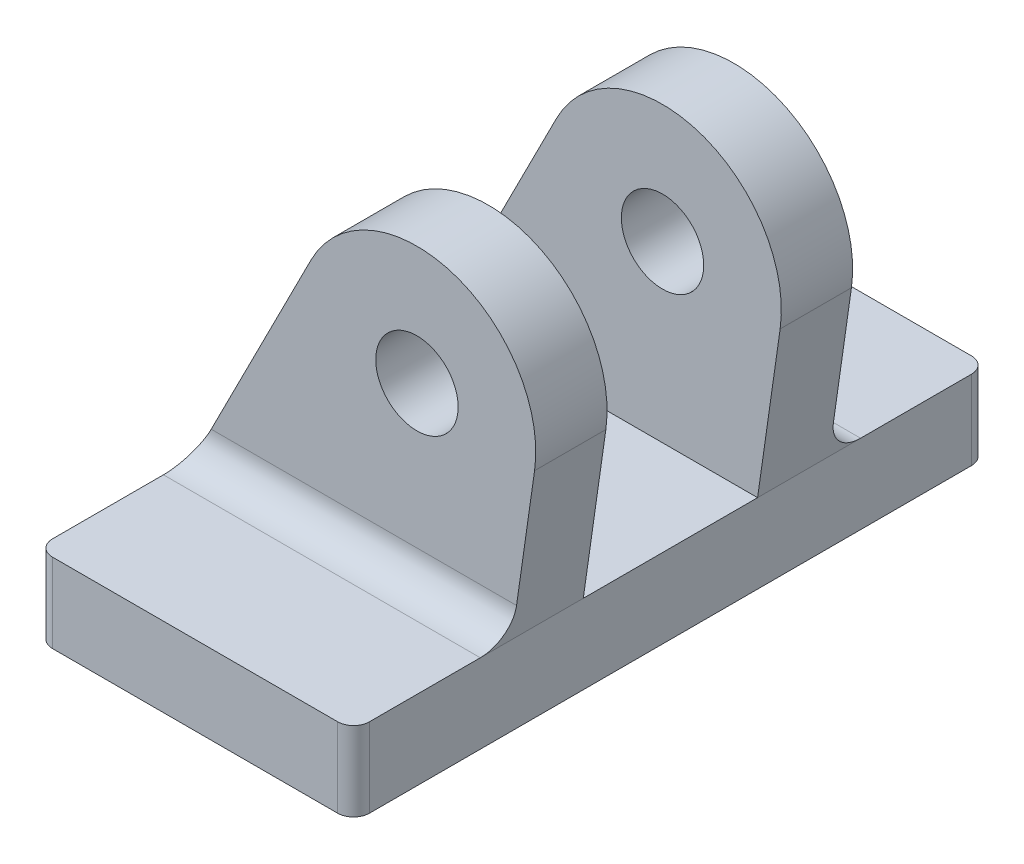
ISO-10303-21;
HEADER;
FILE_DESCRIPTION(('STEP AP214'),'2;1');
FILE_NAME('part.step','',(''),(''),'','','');
FILE_SCHEMA(('AUTOMOTIVE_DESIGN { 1 0 10303 214 1 1 1 1 }'));
ENDSEC;
DATA;
#1=APPLICATION_CONTEXT('core data for automotive mechanical design processes');
#2=APPLICATION_PROTOCOL_DEFINITION('international standard','automotive_design',2000,#1);
#3=PRODUCT_CONTEXT('',#1,'mechanical');
#4=PRODUCT('Part','Part','',(#3));
#5=PRODUCT_RELATED_PRODUCT_CATEGORY('part','',(#4));
#6=PRODUCT_DEFINITION_FORMATION('','',#4);
#7=PRODUCT_DEFINITION_CONTEXT('part definition',#1,'design');
#8=PRODUCT_DEFINITION('design','',#6,#7);
#9=PRODUCT_DEFINITION_SHAPE('','',#8);
#10=(LENGTH_UNIT() NAMED_UNIT(*) SI_UNIT(.MILLI.,.METRE.));
#11=(NAMED_UNIT(*) PLANE_ANGLE_UNIT() SI_UNIT($,.RADIAN.));
#12=(NAMED_UNIT(*) SI_UNIT($,.STERADIAN.) SOLID_ANGLE_UNIT());
#13=UNCERTAINTY_MEASURE_WITH_UNIT(LENGTH_MEASURE(1.E-05),#10,'distance_accuracy_value','');
#14=(GEOMETRIC_REPRESENTATION_CONTEXT(3) GLOBAL_UNCERTAINTY_ASSIGNED_CONTEXT((#13)) GLOBAL_UNIT_ASSIGNED_CONTEXT((#10,
#11,#12)) REPRESENTATION_CONTEXT('',''));
#15=CARTESIAN_POINT('',(0.,0.,0.));
#16=DIRECTION('',(0.,0.,1.));
#17=DIRECTION('',(1.,0.,0.));
#18=AXIS2_PLACEMENT_3D('',#15,#16,#17);
#19=CARTESIAN_POINT('',(9.09646430033625,-1.30381127766227,10.));
#20=DIRECTION('',(0.989883627066026,-0.141881657963986,0.));
#21=DIRECTION('',(0.141881657963986,0.989883627066026,0.));
#22=AXIS2_PLACEMENT_3D('',#19,#20,#21);
#23=PLANE('',#22);
#24=DIRECTION('',(0.,0.,-1.));
#25=VECTOR('',#24,1.);
#26=CARTESIAN_POINT('',(11.4241272029952,14.9358875652701,10.));
#27=LINE('',#26,#25);
#28=CARTESIAN_POINT('',(11.4241272029952,14.9358875652701,-5.5));
#29=VERTEX_POINT('',#28);
#30=CARTESIAN_POINT('',(11.4241272029952,14.9358875652701,-10.));
#31=VERTEX_POINT('',#30);
#32=EDGE_CURVE('E172',#29,#31,#27,.T.);
#33=ORIENTED_EDGE('',*,*,#32,.F.);
#34=DIRECTION('',(-0.141881657963986,-0.989883627066026,0.));
#35=VECTOR('',#34,1.);
#36=CARTESIAN_POINT('',(9.09646430033625,-1.30381127766227,-5.5));
#37=LINE('',#36,#35);
#38=CARTESIAN_POINT('',(10.,5.,-5.5));
#39=VERTEX_POINT('',#38);
#40=EDGE_CURVE('E156',#29,#39,#37,.T.);
#41=ORIENTED_EDGE('',*,*,#40,.T.);
#42=DIRECTION('',(0.,0.,-1.));
#43=VECTOR('',#42,1.);
#44=CARTESIAN_POINT('',(10.,5.,10.));
#45=LINE('',#44,#43);
#46=CARTESIAN_POINT('',(10.,5.,-12.));
#47=VERTEX_POINT('',#46);
#48=EDGE_CURVE('E292',#39,#47,#45,.T.);
#49=ORIENTED_EDGE('',*,*,#48,.T.);
#50=CARTESIAN_POINT('',(10.286663308867,7.,-12.));
#51=DIRECTION('',(0.989883627066026,-0.141881657963986,0.));
#52=DIRECTION('',(0.141881657963986,0.989883627066026,0.));
#53=AXIS2_PLACEMENT_3D('',#50,#51,#52);
#54=ELLIPSE('',#53,2.02043951967154,2.);
#55=CARTESIAN_POINT('',(10.286663308867,7.00000000000001,-10.));
#56=VERTEX_POINT('',#55);
#57=EDGE_CURVE('E243',#47,#56,#54,.F.);
#58=ORIENTED_EDGE('',*,*,#57,.T.);
#59=DIRECTION('',(-0.141881657963986,-0.989883627066026,0.));
#60=VECTOR('',#59,1.);
#61=CARTESIAN_POINT('',(9.09646430033625,-1.30381127766227,-10.));
#62=LINE('',#61,#60);
#63=EDGE_CURVE('E179',#31,#56,#62,.T.);
#64=ORIENTED_EDGE('',*,*,#63,.F.);
#65=EDGE_LOOP('',(#33,#41,#49,#58,#64));
#66=FACE_BOUND('',#65,.T.);
#67=ADVANCED_FACE('F35',(#66),#23,.T.);
#68=CARTESIAN_POINT('',(4.,16.,10.));
#69=DIRECTION('',(0.,0.,-1.));
#70=DIRECTION('',(-1.,0.,0.));
#71=AXIS2_PLACEMENT_3D('',#68,#69,#70);
#72=CYLINDRICAL_SURFACE('',#71,7.5);
#73=CARTESIAN_POINT('',(4.,16.,-5.5));
#74=DIRECTION('',(0.,0.,1.));
#75=DIRECTION('',(1.,0.,0.));
#76=AXIS2_PLACEMENT_3D('',#73,#74,#75);
#77=CIRCLE('',#76,7.5);
#78=CARTESIAN_POINT('',(-2.68671864072965,19.3967328154741,-5.5));
#79=VERTEX_POINT('',#78);
#80=EDGE_CURVE('E159',#29,#79,#77,.T.);
#81=ORIENTED_EDGE('',*,*,#80,.F.);
#82=ORIENTED_EDGE('',*,*,#32,.T.);
#83=CARTESIAN_POINT('',(4.,16.,-10.));
#84=DIRECTION('',(0.,0.,1.));
#85=DIRECTION('',(1.,0.,0.));
#86=AXIS2_PLACEMENT_3D('',#83,#84,#85);
#87=CIRCLE('',#86,7.5);
#88=CARTESIAN_POINT('',(-2.68671864072965,19.3967328154741,-10.));
#89=VERTEX_POINT('',#88);
#90=EDGE_CURVE('E295',#31,#89,#87,.T.);
#91=ORIENTED_EDGE('',*,*,#90,.T.);
#92=DIRECTION('',(0.,0.,-1.));
#93=VECTOR('',#92,1.);
#94=CARTESIAN_POINT('',(-2.68671864072965,19.3967328154741,10.));
#95=LINE('',#94,#93);
#96=EDGE_CURVE('E174',#79,#89,#95,.T.);
#97=ORIENTED_EDGE('',*,*,#96,.F.);
#98=EDGE_LOOP('',(#81,#82,#91,#97));
#99=FACE_BOUND('',#98,.T.);
#100=ADVANCED_FACE('F170',(#99),#72,.T.);
#101=CARTESIAN_POINT('',(-9.96776968847748,5.06344774127433,10.));
#102=DIRECTION('',(0.89156248543062,-0.45289770872988,0.));
#103=DIRECTION('',(0.45289770872988,0.89156248543062,0.));
#104=AXIS2_PLACEMENT_3D('',#101,#102,#103);
#105=PLANE('',#104);
#106=DIRECTION('',(-0.45289770872988,-0.89156248543062,0.));
#107=VECTOR('',#106,1.);
#108=CARTESIAN_POINT('',(-9.96776968847748,5.06344774127433,-5.5));
#109=LINE('',#108,#107);
#110=CARTESIAN_POINT('',(-10.,5.,-5.5));
#111=VERTEX_POINT('',#110);
#112=EDGE_CURVE('E175',#79,#111,#109,.T.);
#113=ORIENTED_EDGE('',*,*,#112,.F.);
#114=ORIENTED_EDGE('',*,*,#96,.T.);
#115=DIRECTION('',(-0.45289770872988,-0.89156248543062,0.));
#116=VECTOR('',#115,1.);
#117=CARTESIAN_POINT('',(-9.96776968847748,5.06344774127433,-10.));
#118=LINE('',#117,#116);
#119=CARTESIAN_POINT('',(-8.9840359680205,7.,-10.));
#120=VERTEX_POINT('',#119);
#121=EDGE_CURVE('E285',#89,#120,#118,.T.);
#122=ORIENTED_EDGE('',*,*,#121,.T.);
#123=CARTESIAN_POINT('',(-8.9840359680205,7.,-12.));
#124=DIRECTION('',(0.89156248543062,-0.45289770872988,0.));
#125=DIRECTION('',(0.45289770872988,0.89156248543062,0.));
#126=AXIS2_PLACEMENT_3D('',#123,#124,#125);
#127=ELLIPSE('',#126,2.24325275309673,2.);
#128=CARTESIAN_POINT('',(-10.,5.,-12.));
#129=VERTEX_POINT('',#128);
#130=EDGE_CURVE('E245',#120,#129,#127,.T.);
#131=ORIENTED_EDGE('',*,*,#130,.T.);
#132=DIRECTION('',(0.,0.,-1.));
#133=VECTOR('',#132,1.);
#134=CARTESIAN_POINT('',(-10.,5.,10.));
#135=LINE('',#134,#133);
#136=EDGE_CURVE('E299',#111,#129,#135,.T.);
#137=ORIENTED_EDGE('',*,*,#136,.F.);
#138=EDGE_LOOP('',(#113,#114,#122,#131,#137));
#139=FACE_BOUND('',#138,.T.);
#140=ADVANCED_FACE('F312',(#139),#105,.F.);
#141=CARTESIAN_POINT('',(4.,16.,10.));
#142=DIRECTION('',(0.,0.,-1.));
#143=DIRECTION('',(-1.,0.,0.));
#144=AXIS2_PLACEMENT_3D('',#141,#142,#143);
#145=CYLINDRICAL_SURFACE('',#144,2.6);
#146=CARTESIAN_POINT('',(4.,16.,-10.));
#147=DIRECTION('',(0.,0.,1.));
#148=DIRECTION('',(1.,0.,0.));
#149=AXIS2_PLACEMENT_3D('',#146,#147,#148);
#150=CIRCLE('',#149,2.6);
#151=CARTESIAN_POINT('',(6.6,16.,-10.));
#152=VERTEX_POINT('',#151);
#153=EDGE_CURVE('E273',#152,#152,#150,.T.);
#154=ORIENTED_EDGE('',*,*,#153,.F.);
#155=EDGE_LOOP('',(#154));
#156=FACE_BOUND('',#155,.T.);
#157=CARTESIAN_POINT('',(4.,16.,-5.5));
#158=DIRECTION('',(0.,0.,1.));
#159=DIRECTION('',(1.,0.,0.));
#160=AXIS2_PLACEMENT_3D('',#157,#158,#159);
#161=CIRCLE('',#160,2.6);
#162=CARTESIAN_POINT('',(6.6,16.,-5.5));
#163=VERTEX_POINT('',#162);
#164=EDGE_CURVE('E166',#163,#163,#161,.T.);
#165=ORIENTED_EDGE('',*,*,#164,.T.);
#166=EDGE_LOOP('',(#165));
#167=FACE_BOUND('',#166,.T.);
#168=ADVANCED_FACE('F342',(#156,#167),#145,.F.);
#169=DIRECTION('',(-0.141881657963986,-0.989883627066026,0.));
#170=VECTOR('',#169,1.);
#171=CARTESIAN_POINT('',(9.09646430033625,-1.30381127766227,5.5));
#172=LINE('',#171,#170);
#173=CARTESIAN_POINT('',(11.4241272029952,14.9358875652701,5.5));
#174=VERTEX_POINT('',#173);
#175=CARTESIAN_POINT('',(10.,5.,5.5));
#176=VERTEX_POINT('',#175);
#177=EDGE_CURVE('E379',#174,#176,#172,.T.);
#178=ORIENTED_EDGE('',*,*,#177,.F.);
#179=CARTESIAN_POINT('',(11.4241272029952,14.9358875652701,10.));
#180=VERTEX_POINT('',#179);
#181=EDGE_CURVE('E180',#180,#174,#27,.T.);
#182=ORIENTED_EDGE('',*,*,#181,.F.);
#183=DIRECTION('',(-0.141881657963986,-0.989883627066026,0.));
#184=VECTOR('',#183,1.);
#185=CARTESIAN_POINT('',(9.09646430033625,-1.30381127766227,10.));
#186=LINE('',#185,#184);
#187=CARTESIAN_POINT('',(10.286663308867,7.00000000000001,10.));
#188=VERTEX_POINT('',#187);
#189=EDGE_CURVE('E254',#180,#188,#186,.T.);
#190=ORIENTED_EDGE('',*,*,#189,.T.);
#191=CARTESIAN_POINT('',(10.286663308867,7.,12.));
#192=DIRECTION('',(0.989883627066026,-0.141881657963986,0.));
#193=DIRECTION('',(-0.141881657963986,-0.989883627066026,0.));
#194=AXIS2_PLACEMENT_3D('',#191,#192,#193);
#195=ELLIPSE('',#194,2.02043951967154,2.);
#196=CARTESIAN_POINT('',(10.,5.,12.));
#197=VERTEX_POINT('',#196);
#198=EDGE_CURVE('E44',#188,#197,#195,.F.);
#199=ORIENTED_EDGE('',*,*,#198,.T.);
#200=EDGE_CURVE('E51',#197,#176,#45,.T.);
#201=ORIENTED_EDGE('',*,*,#200,.T.);
#202=EDGE_LOOP('',(#178,#182,#190,#199,#201));
#203=FACE_BOUND('',#202,.T.);
#204=ADVANCED_FACE('F252',(#203),#23,.T.);
#205=ORIENTED_EDGE('',*,*,#181,.T.);
#206=CARTESIAN_POINT('',(4.,16.,5.5));
#207=DIRECTION('',(0.,0.,1.));
#208=DIRECTION('',(1.,0.,0.));
#209=AXIS2_PLACEMENT_3D('',#206,#207,#208);
#210=CIRCLE('',#209,7.5);
#211=CARTESIAN_POINT('',(-2.68671864072965,19.3967328154741,5.5));
#212=VERTEX_POINT('',#211);
#213=EDGE_CURVE('E376',#174,#212,#210,.T.);
#214=ORIENTED_EDGE('',*,*,#213,.T.);
#215=CARTESIAN_POINT('',(-2.68671864072965,19.3967328154741,10.));
#216=VERTEX_POINT('',#215);
#217=EDGE_CURVE('E181',#216,#212,#95,.T.);
#218=ORIENTED_EDGE('',*,*,#217,.F.);
#219=CARTESIAN_POINT('',(4.,16.,10.));
#220=DIRECTION('',(0.,0.,1.));
#221=DIRECTION('',(1.,0.,0.));
#222=AXIS2_PLACEMENT_3D('',#219,#220,#221);
#223=CIRCLE('',#222,7.5);
#224=EDGE_CURVE('E287',#180,#216,#223,.T.);
#225=ORIENTED_EDGE('',*,*,#224,.F.);
#226=EDGE_LOOP('',(#205,#214,#218,#225));
#227=FACE_BOUND('',#226,.T.);
#228=ADVANCED_FACE('F339',(#227),#72,.T.);
#229=ORIENTED_EDGE('',*,*,#217,.T.);
#230=DIRECTION('',(-0.45289770872988,-0.89156248543062,0.));
#231=VECTOR('',#230,1.);
#232=CARTESIAN_POINT('',(-9.96776968847748,5.06344774127433,5.5));
#233=LINE('',#232,#231);
#234=CARTESIAN_POINT('',(-10.,5.,5.5));
#235=VERTEX_POINT('',#234);
#236=EDGE_CURVE('E371',#212,#235,#233,.T.);
#237=ORIENTED_EDGE('',*,*,#236,.T.);
#238=CARTESIAN_POINT('',(-10.,5.,12.));
#239=VERTEX_POINT('',#238);
#240=EDGE_CURVE('E270',#239,#235,#135,.T.);
#241=ORIENTED_EDGE('',*,*,#240,.F.);
#242=CARTESIAN_POINT('',(-8.9840359680205,7.,12.));
#243=DIRECTION('',(0.89156248543062,-0.45289770872988,0.));
#244=DIRECTION('',(-0.45289770872988,-0.89156248543062,0.));
#245=AXIS2_PLACEMENT_3D('',#242,#243,#244);
#246=ELLIPSE('',#245,2.24325275309673,2.);
#247=CARTESIAN_POINT('',(-8.9840359680205,7.,10.));
#248=VERTEX_POINT('',#247);
#249=EDGE_CURVE('E11',#239,#248,#246,.T.);
#250=ORIENTED_EDGE('',*,*,#249,.T.);
#251=DIRECTION('',(-0.45289770872988,-0.89156248543062,0.));
#252=VECTOR('',#251,1.);
#253=CARTESIAN_POINT('',(-9.96776968847748,5.06344774127433,10.));
#254=LINE('',#253,#252);
#255=EDGE_CURVE('E290',#216,#248,#254,.T.);
#256=ORIENTED_EDGE('',*,*,#255,.F.);
#257=EDGE_LOOP('',(#229,#237,#241,#250,#256));
#258=FACE_BOUND('',#257,.T.);
#259=ADVANCED_FACE('F347',(#258),#105,.F.);
#260=CARTESIAN_POINT('',(4.,16.,5.5));
#261=DIRECTION('',(0.,0.,1.));
#262=DIRECTION('',(1.,0.,0.));
#263=AXIS2_PLACEMENT_3D('',#260,#261,#262);
#264=CIRCLE('',#263,2.6);
#265=CARTESIAN_POINT('',(6.6,16.,5.5));
#266=VERTEX_POINT('',#265);
#267=EDGE_CURVE('E365',#266,#266,#264,.T.);
#268=ORIENTED_EDGE('',*,*,#267,.F.);
#269=EDGE_LOOP('',(#268));
#270=FACE_BOUND('',#269,.T.);
#271=CARTESIAN_POINT('',(4.,16.,10.));
#272=DIRECTION('',(0.,0.,1.));
#273=DIRECTION('',(1.,0.,0.));
#274=AXIS2_PLACEMENT_3D('',#271,#272,#273);
#275=CIRCLE('',#274,2.6);
#276=CARTESIAN_POINT('',(6.6,16.,10.));
#277=VERTEX_POINT('',#276);
#278=EDGE_CURVE('E282',#277,#277,#275,.T.);
#279=ORIENTED_EDGE('',*,*,#278,.T.);
#280=EDGE_LOOP('',(#279));
#281=FACE_BOUND('',#280,.T.);
#282=ADVANCED_FACE('F329',(#270,#281),#145,.F.);
#283=CARTESIAN_POINT('',(0.,0.,10.));
#284=DIRECTION('',(0.,0.,1.));
#285=DIRECTION('',(1.,0.,0.));
#286=AXIS2_PLACEMENT_3D('',#283,#284,#285);
#287=PLANE('',#286);
#288=ORIENTED_EDGE('',*,*,#278,.F.);
#289=EDGE_LOOP('',(#288));
#290=FACE_BOUND('',#289,.T.);
#291=ORIENTED_EDGE('',*,*,#255,.T.);
#292=DIRECTION('',(1.,0.,0.));
#293=VECTOR('',#292,1.);
#294=CARTESIAN_POINT('',(10.,7.,10.));
#295=LINE('',#294,#293);
#296=EDGE_CURVE('E237',#248,#188,#295,.T.);
#297=ORIENTED_EDGE('',*,*,#296,.T.);
#298=ORIENTED_EDGE('',*,*,#189,.F.);
#299=ORIENTED_EDGE('',*,*,#224,.T.);
#300=EDGE_LOOP('',(#291,#297,#298,#299));
#301=FACE_BOUND('',#300,.T.);
#302=ADVANCED_FACE('F321',(#290,#301),#287,.T.);
#303=CARTESIAN_POINT('',(0.,0.,-10.));
#304=DIRECTION('',(0.,0.,1.));
#305=DIRECTION('',(1.,0.,0.));
#306=AXIS2_PLACEMENT_3D('',#303,#304,#305);
#307=PLANE('',#306);
#308=ORIENTED_EDGE('',*,*,#153,.T.);
#309=EDGE_LOOP('',(#308));
#310=FACE_BOUND('',#309,.T.);
#311=ORIENTED_EDGE('',*,*,#63,.T.);
#312=DIRECTION('',(1.,0.,0.));
#313=VECTOR('',#312,1.);
#314=CARTESIAN_POINT('',(0.,7.,-10.));
#315=LINE('',#314,#313);
#316=EDGE_CURVE('E235',#56,#120,#315,.F.);
#317=ORIENTED_EDGE('',*,*,#316,.T.);
#318=ORIENTED_EDGE('',*,*,#121,.F.);
#319=ORIENTED_EDGE('',*,*,#90,.F.);
#320=EDGE_LOOP('',(#311,#317,#318,#319));
#321=FACE_BOUND('',#320,.T.);
#322=ADVANCED_FACE('F319',(#310,#321),#307,.F.);
#323=CARTESIAN_POINT('',(0.,5.,20.));
#324=DIRECTION('',(0.,1.,0.));
#325=DIRECTION('',(-1.,0.,0.));
#326=AXIS2_PLACEMENT_3D('',#323,#324,#325);
#327=PLANE('',#326);
#328=DIRECTION('',(0.,0.,-1.));
#329=VECTOR('',#328,1.);
#330=CARTESIAN_POINT('',(10.,5.,20.));
#331=LINE('',#330,#329);
#332=CARTESIAN_POINT('',(10.,5.,19.));
#333=VERTEX_POINT('',#332);
#334=EDGE_CURVE('E264',#333,#197,#331,.T.);
#335=ORIENTED_EDGE('',*,*,#334,.T.);
#336=DIRECTION('',(1.,0.,0.));
#337=VECTOR('',#336,1.);
#338=CARTESIAN_POINT('',(-10.,5.,12.));
#339=LINE('',#338,#337);
#340=EDGE_CURVE('E240',#197,#239,#339,.F.);
#341=ORIENTED_EDGE('',*,*,#340,.T.);
#342=DIRECTION('',(0.,0.,-1.));
#343=VECTOR('',#342,1.);
#344=CARTESIAN_POINT('',(-10.,5.,20.));
#345=LINE('',#344,#343);
#346=CARTESIAN_POINT('',(-10.,5.,19.));
#347=VERTEX_POINT('',#346);
#348=EDGE_CURVE('E262',#347,#239,#345,.T.);
#349=ORIENTED_EDGE('',*,*,#348,.F.);
#350=CARTESIAN_POINT('',(-9.00000000000001,5.,19.));
#351=DIRECTION('',(0.,1.,0.));
#352=DIRECTION('',(-1.,0.,0.));
#353=AXIS2_PLACEMENT_3D('',#350,#351,#352);
#354=CIRCLE('',#353,1.);
#355=CARTESIAN_POINT('',(-9.00000000000001,5.,20.));
#356=VERTEX_POINT('',#355);
#357=EDGE_CURVE('E230',#347,#356,#354,.T.);
#358=ORIENTED_EDGE('',*,*,#357,.T.);
#359=DIRECTION('',(1.,0.,0.));
#360=VECTOR('',#359,1.);
#361=CARTESIAN_POINT('',(0.,5.,20.));
#362=LINE('',#361,#360);
#363=CARTESIAN_POINT('',(9.,5.,20.));
#364=VERTEX_POINT('',#363);
#365=EDGE_CURVE('E387',#356,#364,#362,.T.);
#366=ORIENTED_EDGE('',*,*,#365,.T.);
#367=CARTESIAN_POINT('',(9.,5.,19.));
#368=DIRECTION('',(0.,1.,0.));
#369=DIRECTION('',(-1.,0.,0.));
#370=AXIS2_PLACEMENT_3D('',#367,#368,#369);
#371=CIRCLE('',#370,1.);
#372=EDGE_CURVE('E228',#364,#333,#371,.T.);
#373=ORIENTED_EDGE('',*,*,#372,.T.);
#374=EDGE_LOOP('',(#335,#341,#349,#358,#366,#373));
#375=FACE_BOUND('',#374,.T.);
#376=ADVANCED_FACE('F261',(#375),#327,.T.);
#377=CARTESIAN_POINT('',(-10.,5.,-19.));
#378=VERTEX_POINT('',#377);
#379=EDGE_CURVE('E274',#129,#378,#345,.T.);
#380=ORIENTED_EDGE('',*,*,#379,.F.);
#381=DIRECTION('',(1.,0.,0.));
#382=VECTOR('',#381,1.);
#383=CARTESIAN_POINT('',(0.,5.,-12.));
#384=LINE('',#383,#382);
#385=EDGE_CURVE('E232',#129,#47,#384,.T.);
#386=ORIENTED_EDGE('',*,*,#385,.T.);
#387=CARTESIAN_POINT('',(10.,5.,-19.));
#388=VERTEX_POINT('',#387);
#389=EDGE_CURVE('E394',#47,#388,#331,.T.);
#390=ORIENTED_EDGE('',*,*,#389,.T.);
#391=CARTESIAN_POINT('',(9.,5.,-19.));
#392=DIRECTION('',(0.,1.,0.));
#393=DIRECTION('',(-1.,0.,0.));
#394=AXIS2_PLACEMENT_3D('',#391,#392,#393);
#395=CIRCLE('',#394,1.);
#396=CARTESIAN_POINT('',(9.,5.,-20.));
#397=VERTEX_POINT('',#396);
#398=EDGE_CURVE('E212',#388,#397,#395,.T.);
#399=ORIENTED_EDGE('',*,*,#398,.T.);
#400=DIRECTION('',(1.,0.,0.));
#401=VECTOR('',#400,1.);
#402=CARTESIAN_POINT('',(0.,5.,-20.));
#403=LINE('',#402,#401);
#404=CARTESIAN_POINT('',(-9.00000000000001,5.,-20.));
#405=VERTEX_POINT('',#404);
#406=EDGE_CURVE('E385',#405,#397,#403,.T.);
#407=ORIENTED_EDGE('',*,*,#406,.F.);
#408=CARTESIAN_POINT('',(-9.00000000000001,5.,-19.));
#409=DIRECTION('',(0.,1.,0.));
#410=DIRECTION('',(-1.,0.,0.));
#411=AXIS2_PLACEMENT_3D('',#408,#409,#410);
#412=CIRCLE('',#411,1.);
#413=EDGE_CURVE('E214',#405,#378,#412,.T.);
#414=ORIENTED_EDGE('',*,*,#413,.T.);
#415=EDGE_LOOP('',(#380,#386,#390,#399,#407,#414));
#416=FACE_BOUND('',#415,.T.);
#417=ADVANCED_FACE('F305',(#416),#327,.T.);
#418=CARTESIAN_POINT('',(-10.,0.,20.));
#419=DIRECTION('',(1.,0.,0.));
#420=DIRECTION('',(0.,1.,0.));
#421=AXIS2_PLACEMENT_3D('',#418,#419,#420);
#422=PLANE('',#421);
#423=ORIENTED_EDGE('',*,*,#136,.T.);
#424=ORIENTED_EDGE('',*,*,#379,.T.);
#425=DIRECTION('',(0.,-1.,0.));
#426=VECTOR('',#425,1.);
#427=CARTESIAN_POINT('',(-10.,0.,-19.));
#428=LINE('',#427,#426);
#429=CARTESIAN_POINT('',(-10.,0.,-19.));
#430=VERTEX_POINT('',#429);
#431=EDGE_CURVE('E196',#378,#430,#428,.T.);
#432=ORIENTED_EDGE('',*,*,#431,.T.);
#433=DIRECTION('',(0.,0.,-1.));
#434=VECTOR('',#433,1.);
#435=CARTESIAN_POINT('',(-10.,0.,20.));
#436=LINE('',#435,#434);
#437=CARTESIAN_POINT('',(-10.,0.,19.));
#438=VERTEX_POINT('',#437);
#439=EDGE_CURVE('E278',#438,#430,#436,.T.);
#440=ORIENTED_EDGE('',*,*,#439,.F.);
#441=DIRECTION('',(0.,-1.,0.));
#442=VECTOR('',#441,1.);
#443=CARTESIAN_POINT('',(-10.,5.,19.));
#444=LINE('',#443,#442);
#445=EDGE_CURVE('E194',#438,#347,#444,.F.);
#446=ORIENTED_EDGE('',*,*,#445,.T.);
#447=ORIENTED_EDGE('',*,*,#348,.T.);
#448=ORIENTED_EDGE('',*,*,#240,.T.);
#449=DIRECTION('',(0.,0.,1.));
#450=VECTOR('',#449,1.);
#451=CARTESIAN_POINT('',(-10.,5.,-5.5));
#452=LINE('',#451,#450);
#453=EDGE_CURVE('E302',#111,#235,#452,.T.);
#454=ORIENTED_EDGE('',*,*,#453,.F.);
#455=EDGE_LOOP('',(#423,#424,#432,#440,#446,#447,#448,#454));
#456=FACE_BOUND('',#455,.T.);
#457=ADVANCED_FACE('F268',(#456),#422,.F.);
#458=CARTESIAN_POINT('',(0.,0.,20.));
#459=DIRECTION('',(0.,1.,0.));
#460=DIRECTION('',(0.,0.,1.));
#461=AXIS2_PLACEMENT_3D('',#458,#459,#460);
#462=PLANE('',#461);
#463=CARTESIAN_POINT('',(0.,0.,-10.));
#464=DIRECTION('',(0.,1.,0.));
#465=DIRECTION('',(0.,0.,1.));
#466=AXIS2_PLACEMENT_3D('',#463,#464,#465);
#467=CIRCLE('',#466,2.);
#468=CARTESIAN_POINT('',(0.,0.,-8.));
#469=VERTEX_POINT('',#468);
#470=EDGE_CURVE('E191',#469,#469,#467,.F.);
#471=ORIENTED_EDGE('',*,*,#470,.F.);
#472=EDGE_LOOP('',(#471));
#473=FACE_BOUND('',#472,.T.);
#474=CARTESIAN_POINT('',(0.,0.,10.));
#475=DIRECTION('',(0.,1.,0.));
#476=DIRECTION('',(0.,0.,1.));
#477=AXIS2_PLACEMENT_3D('',#474,#475,#476);
#478=CIRCLE('',#477,2.);
#479=CARTESIAN_POINT('',(0.,0.,12.));
#480=VERTEX_POINT('',#479);
#481=EDGE_CURVE('E184',#480,#480,#478,.F.);
#482=ORIENTED_EDGE('',*,*,#481,.F.);
#483=EDGE_LOOP('',(#482));
#484=FACE_BOUND('',#483,.T.);
#485=ORIENTED_EDGE('',*,*,#439,.T.);
#486=CARTESIAN_POINT('',(-9.,0.,-19.));
#487=DIRECTION('',(0.,1.,0.));
#488=DIRECTION('',(0.,0.,1.));
#489=AXIS2_PLACEMENT_3D('',#486,#487,#488);
#490=CIRCLE('',#489,1.);
#491=CARTESIAN_POINT('',(-9.,0.,-20.));
#492=VERTEX_POINT('',#491);
#493=EDGE_CURVE('E205',#430,#492,#490,.F.);
#494=ORIENTED_EDGE('',*,*,#493,.T.);
#495=DIRECTION('',(1.,0.,0.));
#496=VECTOR('',#495,1.);
#497=CARTESIAN_POINT('',(0.,0.,-20.));
#498=LINE('',#497,#496);
#499=CARTESIAN_POINT('',(9.,0.,-20.));
#500=VERTEX_POINT('',#499);
#501=EDGE_CURVE('E391',#492,#500,#498,.T.);
#502=ORIENTED_EDGE('',*,*,#501,.T.);
#503=CARTESIAN_POINT('',(9.,0.,-19.));
#504=DIRECTION('',(0.,1.,0.));
#505=DIRECTION('',(0.,0.,1.));
#506=AXIS2_PLACEMENT_3D('',#503,#504,#505);
#507=CIRCLE('',#506,1.);
#508=CARTESIAN_POINT('',(10.,0.,-19.));
#509=VERTEX_POINT('',#508);
#510=EDGE_CURVE('E203',#500,#509,#507,.F.);
#511=ORIENTED_EDGE('',*,*,#510,.T.);
#512=DIRECTION('',(0.,0.,-1.));
#513=VECTOR('',#512,1.);
#514=CARTESIAN_POINT('',(10.,0.,20.));
#515=LINE('',#514,#513);
#516=CARTESIAN_POINT('',(10.,0.,19.));
#517=VERTEX_POINT('',#516);
#518=EDGE_CURVE('E399',#517,#509,#515,.T.);
#519=ORIENTED_EDGE('',*,*,#518,.F.);
#520=CARTESIAN_POINT('',(9.,0.,19.));
#521=DIRECTION('',(0.,1.,0.));
#522=DIRECTION('',(0.,0.,1.));
#523=AXIS2_PLACEMENT_3D('',#520,#521,#522);
#524=CIRCLE('',#523,1.);
#525=CARTESIAN_POINT('',(9.,0.,20.));
#526=VERTEX_POINT('',#525);
#527=EDGE_CURVE('E199',#517,#526,#524,.F.);
#528=ORIENTED_EDGE('',*,*,#527,.T.);
#529=DIRECTION('',(1.,0.,0.));
#530=VECTOR('',#529,1.);
#531=CARTESIAN_POINT('',(0.,0.,20.));
#532=LINE('',#531,#530);
#533=CARTESIAN_POINT('',(-9.,0.,20.));
#534=VERTEX_POINT('',#533);
#535=EDGE_CURVE('E390',#534,#526,#532,.T.);
#536=ORIENTED_EDGE('',*,*,#535,.F.);
#537=CARTESIAN_POINT('',(-9.,0.,19.));
#538=DIRECTION('',(0.,1.,0.));
#539=DIRECTION('',(0.,0.,1.));
#540=AXIS2_PLACEMENT_3D('',#537,#538,#539);
#541=CIRCLE('',#540,1.);
#542=EDGE_CURVE('E201',#534,#438,#541,.F.);
#543=ORIENTED_EDGE('',*,*,#542,.T.);
#544=EDGE_LOOP('',(#485,#494,#502,#511,#519,#528,#536,#543));
#545=FACE_BOUND('',#544,.T.);
#546=ADVANCED_FACE('F405',(#473,#484,#545),#462,.F.);
#547=CARTESIAN_POINT('',(10.,0.,20.));
#548=DIRECTION('',(1.,0.,0.));
#549=DIRECTION('',(0.,1.,0.));
#550=AXIS2_PLACEMENT_3D('',#547,#548,#549);
#551=PLANE('',#550);
#552=ORIENTED_EDGE('',*,*,#518,.T.);
#553=DIRECTION('',(0.,-1.,0.));
#554=VECTOR('',#553,1.);
#555=CARTESIAN_POINT('',(10.,5.,-19.));
#556=LINE('',#555,#554);
#557=EDGE_CURVE('E220',#509,#388,#556,.F.);
#558=ORIENTED_EDGE('',*,*,#557,.T.);
#559=ORIENTED_EDGE('',*,*,#389,.F.);
#560=ORIENTED_EDGE('',*,*,#48,.F.);
#561=DIRECTION('',(0.,0.,1.));
#562=VECTOR('',#561,1.);
#563=CARTESIAN_POINT('',(10.,5.,-5.5));
#564=LINE('',#563,#562);
#565=EDGE_CURVE('E383',#39,#176,#564,.T.);
#566=ORIENTED_EDGE('',*,*,#565,.T.);
#567=ORIENTED_EDGE('',*,*,#200,.F.);
#568=ORIENTED_EDGE('',*,*,#334,.F.);
#569=DIRECTION('',(0.,-1.,0.));
#570=VECTOR('',#569,1.);
#571=CARTESIAN_POINT('',(10.,0.,19.));
#572=LINE('',#571,#570);
#573=EDGE_CURVE('E217',#333,#517,#572,.T.);
#574=ORIENTED_EDGE('',*,*,#573,.T.);
#575=EDGE_LOOP('',(#552,#558,#559,#560,#566,#567,#568,#574));
#576=FACE_BOUND('',#575,.T.);
#577=ADVANCED_FACE('F419',(#576),#551,.T.);
#578=CARTESIAN_POINT('',(0.,0.,20.));
#579=DIRECTION('',(0.,0.,1.));
#580=DIRECTION('',(1.,0.,0.));
#581=AXIS2_PLACEMENT_3D('',#578,#579,#580);
#582=PLANE('',#581);
#583=ORIENTED_EDGE('',*,*,#365,.F.);
#584=DIRECTION('',(0.,-1.,0.));
#585=VECTOR('',#584,1.);
#586=CARTESIAN_POINT('',(-9.,0.,20.));
#587=LINE('',#586,#585);
#588=EDGE_CURVE('E225',#356,#534,#587,.T.);
#589=ORIENTED_EDGE('',*,*,#588,.T.);
#590=ORIENTED_EDGE('',*,*,#535,.T.);
#591=DIRECTION('',(0.,-1.,0.));
#592=VECTOR('',#591,1.);
#593=CARTESIAN_POINT('',(9.,0.,20.));
#594=LINE('',#593,#592);
#595=EDGE_CURVE('E223',#526,#364,#594,.F.);
#596=ORIENTED_EDGE('',*,*,#595,.T.);
#597=EDGE_LOOP('',(#583,#589,#590,#596));
#598=FACE_BOUND('',#597,.T.);
#599=ADVANCED_FACE('F414',(#598),#582,.T.);
#600=CARTESIAN_POINT('',(0.,0.,-20.));
#601=DIRECTION('',(0.,0.,1.));
#602=DIRECTION('',(1.,0.,0.));
#603=AXIS2_PLACEMENT_3D('',#600,#601,#602);
#604=PLANE('',#603);
#605=ORIENTED_EDGE('',*,*,#501,.F.);
#606=DIRECTION('',(0.,-1.,0.));
#607=VECTOR('',#606,1.);
#608=CARTESIAN_POINT('',(-9.,0.,-20.));
#609=LINE('',#608,#607);
#610=EDGE_CURVE('E210',#492,#405,#609,.F.);
#611=ORIENTED_EDGE('',*,*,#610,.T.);
#612=ORIENTED_EDGE('',*,*,#406,.T.);
#613=DIRECTION('',(0.,-1.,0.));
#614=VECTOR('',#613,1.);
#615=CARTESIAN_POINT('',(9.,0.,-20.));
#616=LINE('',#615,#614);
#617=EDGE_CURVE('E207',#397,#500,#616,.T.);
#618=ORIENTED_EDGE('',*,*,#617,.T.);
#619=EDGE_LOOP('',(#605,#611,#612,#618));
#620=FACE_BOUND('',#619,.T.);
#621=ADVANCED_FACE('F425',(#620),#604,.F.);
#622=CARTESIAN_POINT('',(0.,5.,-5.5));
#623=DIRECTION('',(0.,-1.,0.));
#624=DIRECTION('',(1.,0.,0.));
#625=AXIS2_PLACEMENT_3D('',#622,#623,#624);
#626=PLANE('',#625);
#627=DIRECTION('',(1.,0.,0.));
#628=VECTOR('',#627,1.);
#629=CARTESIAN_POINT('',(0.,5.,5.5));
#630=LINE('',#629,#628);
#631=EDGE_CURVE('E375',#235,#176,#630,.T.);
#632=ORIENTED_EDGE('',*,*,#631,.T.);
#633=ORIENTED_EDGE('',*,*,#565,.F.);
#634=DIRECTION('',(1.,0.,0.));
#635=VECTOR('',#634,1.);
#636=CARTESIAN_POINT('',(0.,5.,-5.5));
#637=LINE('',#636,#635);
#638=EDGE_CURVE('E162',#111,#39,#637,.T.);
#639=ORIENTED_EDGE('',*,*,#638,.F.);
#640=ORIENTED_EDGE('',*,*,#453,.T.);
#641=EDGE_LOOP('',(#632,#633,#639,#640));
#642=FACE_BOUND('',#641,.T.);
#643=ADVANCED_FACE('F553',(#642),#626,.F.);
#644=CARTESIAN_POINT('',(0.,0.,-5.5));
#645=DIRECTION('',(0.,0.,1.));
#646=DIRECTION('',(1.,0.,0.));
#647=AXIS2_PLACEMENT_3D('',#644,#645,#646);
#648=PLANE('',#647);
#649=ORIENTED_EDGE('',*,*,#164,.F.);
#650=EDGE_LOOP('',(#649));
#651=FACE_BOUND('',#650,.T.);
#652=ORIENTED_EDGE('',*,*,#40,.F.);
#653=ORIENTED_EDGE('',*,*,#80,.T.);
#654=ORIENTED_EDGE('',*,*,#112,.T.);
#655=ORIENTED_EDGE('',*,*,#638,.T.);
#656=EDGE_LOOP('',(#652,#653,#654,#655));
#657=FACE_BOUND('',#656,.T.);
#658=ADVANCED_FACE('F158',(#651,#657),#648,.T.);
#659=CARTESIAN_POINT('',(0.,0.,5.5));
#660=DIRECTION('',(0.,0.,1.));
#661=DIRECTION('',(1.,0.,0.));
#662=AXIS2_PLACEMENT_3D('',#659,#660,#661);
#663=PLANE('',#662);
#664=ORIENTED_EDGE('',*,*,#267,.T.);
#665=EDGE_LOOP('',(#664));
#666=FACE_BOUND('',#665,.T.);
#667=ORIENTED_EDGE('',*,*,#177,.T.);
#668=ORIENTED_EDGE('',*,*,#631,.F.);
#669=ORIENTED_EDGE('',*,*,#236,.F.);
#670=ORIENTED_EDGE('',*,*,#213,.F.);
#671=EDGE_LOOP('',(#667,#668,#669,#670));
#672=FACE_BOUND('',#671,.T.);
#673=ADVANCED_FACE('F601',(#666,#672),#663,.F.);
#674=CARTESIAN_POINT('',(0.,-4.,10.));
#675=DIRECTION('',(0.,1.,0.));
#676=DIRECTION('',(0.,0.,1.));
#677=AXIS2_PLACEMENT_3D('',#674,#675,#676);
#678=CYLINDRICAL_SURFACE('',#677,2.);
#679=CARTESIAN_POINT('',(0.,-4.,10.));
#680=DIRECTION('',(0.,-1.,0.));
#681=DIRECTION('',(0.,0.,-1.));
#682=AXIS2_PLACEMENT_3D('',#679,#680,#681);
#683=CIRCLE('',#682,2.);
#684=CARTESIAN_POINT('',(0.,-4.,8.));
#685=VERTEX_POINT('',#684);
#686=EDGE_CURVE('E648',#685,#685,#683,.T.);
#687=ORIENTED_EDGE('',*,*,#686,.F.);
#688=EDGE_LOOP('',(#687));
#689=FACE_BOUND('',#688,.T.);
#690=ORIENTED_EDGE('',*,*,#481,.T.);
#691=EDGE_LOOP('',(#690));
#692=FACE_BOUND('',#691,.T.);
#693=ADVANCED_FACE('F591',(#689,#692),#678,.T.);
#694=CARTESIAN_POINT('',(0.,-4.,10.));
#695=DIRECTION('',(0.,-1.,0.));
#696=DIRECTION('',(0.,0.,-1.));
#697=AXIS2_PLACEMENT_3D('',#694,#695,#696);
#698=PLANE('',#697);
#699=ORIENTED_EDGE('',*,*,#686,.T.);
#700=EDGE_LOOP('',(#699));
#701=FACE_BOUND('',#700,.T.);
#702=ADVANCED_FACE('F581',(#701),#698,.T.);
#703=CARTESIAN_POINT('',(0.,-4.,-10.));
#704=DIRECTION('',(0.,1.,0.));
#705=DIRECTION('',(0.,0.,1.));
#706=AXIS2_PLACEMENT_3D('',#703,#704,#705);
#707=CYLINDRICAL_SURFACE('',#706,2.);
#708=CARTESIAN_POINT('',(0.,-4.,-10.));
#709=DIRECTION('',(0.,-1.,0.));
#710=DIRECTION('',(0.,0.,1.));
#711=AXIS2_PLACEMENT_3D('',#708,#709,#710);
#712=CIRCLE('',#711,2.);
#713=CARTESIAN_POINT('',(0.,-4.,-8.));
#714=VERTEX_POINT('',#713);
#715=EDGE_CURVE('E657',#714,#714,#712,.T.);
#716=ORIENTED_EDGE('',*,*,#715,.F.);
#717=EDGE_LOOP('',(#716));
#718=FACE_BOUND('',#717,.T.);
#719=ORIENTED_EDGE('',*,*,#470,.T.);
#720=EDGE_LOOP('',(#719));
#721=FACE_BOUND('',#720,.T.);
#722=ADVANCED_FACE('F436',(#718,#721),#707,.T.);
#723=CARTESIAN_POINT('',(0.,-4.,-10.));
#724=DIRECTION('',(0.,1.,0.));
#725=DIRECTION('',(0.,0.,1.));
#726=AXIS2_PLACEMENT_3D('',#723,#724,#725);
#727=PLANE('',#726);
#728=ORIENTED_EDGE('',*,*,#715,.T.);
#729=EDGE_LOOP('',(#728));
#730=FACE_BOUND('',#729,.T.);
#731=ADVANCED_FACE('F430',(#730),#727,.F.);
#732=CARTESIAN_POINT('',(-9.,0.,-19.));
#733=DIRECTION('',(0.,-1.,0.));
#734=DIRECTION('',(1.,0.,0.));
#735=AXIS2_PLACEMENT_3D('',#732,#733,#734);
#736=CYLINDRICAL_SURFACE('',#735,1.);
#737=ORIENTED_EDGE('',*,*,#413,.F.);
#738=ORIENTED_EDGE('',*,*,#610,.F.);
#739=ORIENTED_EDGE('',*,*,#493,.F.);
#740=ORIENTED_EDGE('',*,*,#431,.F.);
#741=EDGE_LOOP('',(#737,#738,#739,#740));
#742=FACE_BOUND('',#741,.T.);
#743=ADVANCED_FACE('F428',(#742),#736,.T.);
#744=CARTESIAN_POINT('',(9.,0.,-19.));
#745=DIRECTION('',(0.,1.,0.));
#746=DIRECTION('',(-1.,0.,0.));
#747=AXIS2_PLACEMENT_3D('',#744,#745,#746);
#748=CYLINDRICAL_SURFACE('',#747,1.);
#749=ORIENTED_EDGE('',*,*,#398,.F.);
#750=ORIENTED_EDGE('',*,*,#557,.F.);
#751=ORIENTED_EDGE('',*,*,#510,.F.);
#752=ORIENTED_EDGE('',*,*,#617,.F.);
#753=EDGE_LOOP('',(#749,#750,#751,#752));
#754=FACE_BOUND('',#753,.T.);
#755=ADVANCED_FACE('F423',(#754),#748,.T.);
#756=CARTESIAN_POINT('',(-9.,0.,19.));
#757=DIRECTION('',(0.,1.,0.));
#758=DIRECTION('',(-1.,0.,0.));
#759=AXIS2_PLACEMENT_3D('',#756,#757,#758);
#760=CYLINDRICAL_SURFACE('',#759,1.);
#761=ORIENTED_EDGE('',*,*,#357,.F.);
#762=ORIENTED_EDGE('',*,*,#445,.F.);
#763=ORIENTED_EDGE('',*,*,#542,.F.);
#764=ORIENTED_EDGE('',*,*,#588,.F.);
#765=EDGE_LOOP('',(#761,#762,#763,#764));
#766=FACE_BOUND('',#765,.T.);
#767=ADVANCED_FACE('F409',(#766),#760,.T.);
#768=CARTESIAN_POINT('',(9.,0.,19.));
#769=DIRECTION('',(0.,-1.,0.));
#770=DIRECTION('',(1.,0.,0.));
#771=AXIS2_PLACEMENT_3D('',#768,#769,#770);
#772=CYLINDRICAL_SURFACE('',#771,1.);
#773=ORIENTED_EDGE('',*,*,#372,.F.);
#774=ORIENTED_EDGE('',*,*,#595,.F.);
#775=ORIENTED_EDGE('',*,*,#527,.F.);
#776=ORIENTED_EDGE('',*,*,#573,.F.);
#777=EDGE_LOOP('',(#773,#774,#775,#776));
#778=FACE_BOUND('',#777,.T.);
#779=ADVANCED_FACE('F417',(#778),#772,.T.);
#780=CARTESIAN_POINT('',(0.,7.,-12.));
#781=DIRECTION('',(1.,0.,0.));
#782=DIRECTION('',(0.,1.,0.));
#783=AXIS2_PLACEMENT_3D('',#780,#781,#782);
#784=CYLINDRICAL_SURFACE('',#783,2.);
#785=ORIENTED_EDGE('',*,*,#130,.F.);
#786=ORIENTED_EDGE('',*,*,#316,.F.);
#787=ORIENTED_EDGE('',*,*,#57,.F.);
#788=ORIENTED_EDGE('',*,*,#385,.F.);
#789=EDGE_LOOP('',(#785,#786,#787,#788));
#790=FACE_BOUND('',#789,.T.);
#791=ADVANCED_FACE('F317',(#790),#784,.F.);
#792=CARTESIAN_POINT('',(0.,7.,12.));
#793=DIRECTION('',(-1.,0.,0.));
#794=DIRECTION('',(0.,-1.,0.));
#795=AXIS2_PLACEMENT_3D('',#792,#793,#794);
#796=CYLINDRICAL_SURFACE('',#795,2.);
#797=ORIENTED_EDGE('',*,*,#249,.F.);
#798=ORIENTED_EDGE('',*,*,#340,.F.);
#799=ORIENTED_EDGE('',*,*,#198,.F.);
#800=ORIENTED_EDGE('',*,*,#296,.F.);
#801=EDGE_LOOP('',(#797,#798,#799,#800));
#802=FACE_BOUND('',#801,.T.);
#803=ADVANCED_FACE('F37',(#802),#796,.F.);
#804=CLOSED_SHELL('',(#67,#100,#140,#168,#204,#228,#259,#282,#302,#322,#376,#417,#457,#546,#577,
#599,#621,#643,#658,#673,#693,#702,#722,#731,#743,#755,#767,#779,#791,#803));
#805=MANIFOLD_SOLID_BREP('B2',#804);
#806=ADVANCED_BREP_SHAPE_REPRESENTATION('',(#18,#805),#14);
#807=SHAPE_DEFINITION_REPRESENTATION(#9,#806);
ENDSEC;
END-ISO-10303-21;
